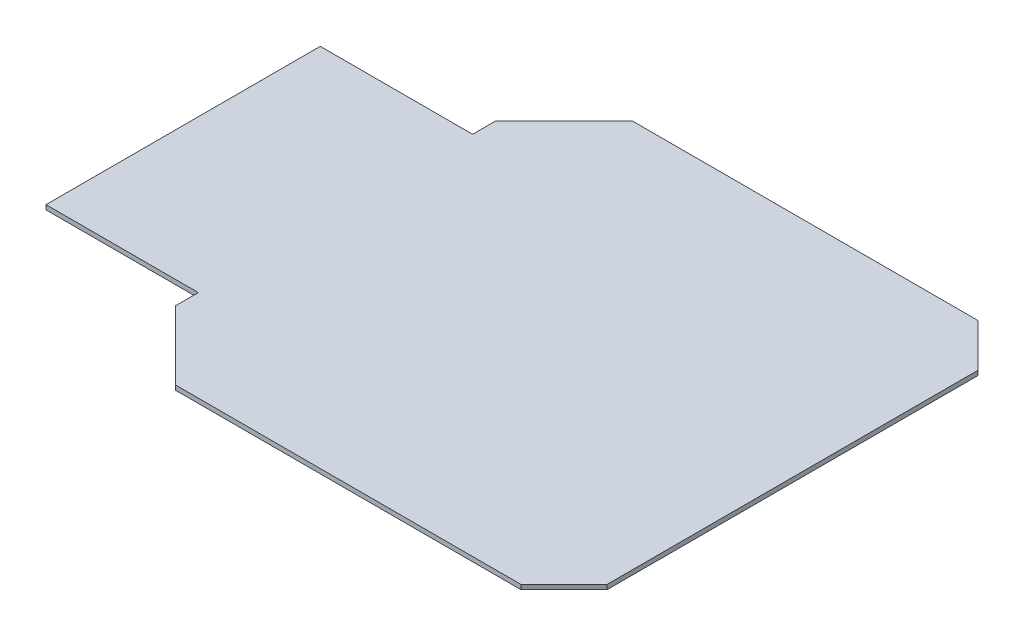
ISO-10303-21;
HEADER;
FILE_DESCRIPTION(('STEP AP214'),'2;1');
FILE_NAME('part.step','',(''),(''),'','','');
FILE_SCHEMA(('AUTOMOTIVE_DESIGN { 1 0 10303 214 1 1 1 1 }'));
ENDSEC;
DATA;
#1=APPLICATION_CONTEXT('core data for automotive mechanical design processes');
#2=APPLICATION_PROTOCOL_DEFINITION('international standard','automotive_design',2000,#1);
#3=PRODUCT_CONTEXT('',#1,'mechanical');
#4=PRODUCT('Part','Part','',(#3));
#5=PRODUCT_RELATED_PRODUCT_CATEGORY('part','',(#4));
#6=PRODUCT_DEFINITION_FORMATION('','',#4);
#7=PRODUCT_DEFINITION_CONTEXT('part definition',#1,'design');
#8=PRODUCT_DEFINITION('design','',#6,#7);
#9=PRODUCT_DEFINITION_SHAPE('','',#8);
#10=(LENGTH_UNIT() NAMED_UNIT(*) SI_UNIT(.MILLI.,.METRE.));
#11=(NAMED_UNIT(*) PLANE_ANGLE_UNIT() SI_UNIT($,.RADIAN.));
#12=(NAMED_UNIT(*) SI_UNIT($,.STERADIAN.) SOLID_ANGLE_UNIT());
#13=UNCERTAINTY_MEASURE_WITH_UNIT(LENGTH_MEASURE(1.E-05),#10,'distance_accuracy_value','');
#14=(GEOMETRIC_REPRESENTATION_CONTEXT(3) GLOBAL_UNCERTAINTY_ASSIGNED_CONTEXT((#13)) GLOBAL_UNIT_ASSIGNED_CONTEXT((#10,
#11,#12)) REPRESENTATION_CONTEXT('',''));
#15=CARTESIAN_POINT('',(0.,0.,0.));
#16=DIRECTION('',(0.,0.,1.));
#17=DIRECTION('',(1.,0.,0.));
#18=AXIS2_PLACEMENT_3D('',#15,#16,#17);
#19=CARTESIAN_POINT('',(126.532096115474,3.,-992.323086709291));
#20=DIRECTION('',(0.70710678118654,0.,-0.707106781186555));
#21=DIRECTION('',(-0.707106781186555,0.,-0.70710678118654));
#22=AXIS2_PLACEMENT_3D('',#19,#20,#21);
#23=PLANE('',#22);
#24=DIRECTION('',(0.707106781186555,0.,0.70710678118654));
#25=VECTOR('',#24,1.);
#26=CARTESIAN_POINT('',(126.532096115474,0.,-992.323086709291));
#27=LINE('',#26,#25);
#28=CARTESIAN_POINT('',(126.532096115474,0.,-992.323086709291));
#29=VERTEX_POINT('',#28);
#30=CARTESIAN_POINT('',(154.816367362936,0.,-964.038815461829));
#31=VERTEX_POINT('',#30);
#32=EDGE_CURVE('E164',#29,#31,#27,.T.);
#33=ORIENTED_EDGE('',*,*,#32,.F.);
#34=DIRECTION('',(0.,-1.,0.));
#35=VECTOR('',#34,1.);
#36=CARTESIAN_POINT('',(126.532096115474,3.,-992.323086709291));
#37=LINE('',#36,#35);
#38=CARTESIAN_POINT('',(126.532096115474,3.,-992.323086709291));
#39=VERTEX_POINT('',#38);
#40=EDGE_CURVE('E194',#39,#29,#37,.T.);
#41=ORIENTED_EDGE('',*,*,#40,.F.);
#42=DIRECTION('',(0.707106781186555,0.,0.70710678118654));
#43=VECTOR('',#42,1.);
#44=CARTESIAN_POINT('',(126.532096115474,3.,-992.323086709291));
#45=LINE('',#44,#43);
#46=CARTESIAN_POINT('',(154.816367362936,3.,-964.038815461829));
#47=VERTEX_POINT('',#46);
#48=EDGE_CURVE('E165',#39,#47,#45,.T.);
#49=ORIENTED_EDGE('',*,*,#48,.T.);
#50=DIRECTION('',(0.,-1.,0.));
#51=VECTOR('',#50,1.);
#52=CARTESIAN_POINT('',(154.816367362936,3.,-964.038815461829));
#53=LINE('',#52,#51);
#54=EDGE_CURVE('E179',#47,#31,#53,.T.);
#55=ORIENTED_EDGE('',*,*,#54,.T.);
#56=EDGE_LOOP('',(#33,#41,#49,#55));
#57=FACE_BOUND('',#56,.T.);
#58=ADVANCED_FACE('F35',(#57),#23,.T.);
#59=CARTESIAN_POINT('',(126.532096115474,3.,-992.323086709291));
#60=DIRECTION('',(0.,0.,1.));
#61=DIRECTION('',(1.,0.,0.));
#62=AXIS2_PLACEMENT_3D('',#59,#60,#61);
#63=PLANE('',#62);
#64=DIRECTION('',(-1.,0.,0.));
#65=VECTOR('',#64,1.);
#66=CARTESIAN_POINT('',(126.532096115474,0.,-992.323086709291));
#67=LINE('',#66,#65);
#68=CARTESIAN_POINT('',(-100.183632637064,0.,-992.323086709291));
#69=VERTEX_POINT('',#68);
#70=EDGE_CURVE('E169',#29,#69,#67,.T.);
#71=ORIENTED_EDGE('',*,*,#70,.T.);
#72=DIRECTION('',(0.,1.,0.));
#73=VECTOR('',#72,1.);
#74=CARTESIAN_POINT('',(-100.183632637064,-57.,-992.323086709291));
#75=LINE('',#74,#73);
#76=CARTESIAN_POINT('',(-100.183632637064,3.,-992.323086709291));
#77=VERTEX_POINT('',#76);
#78=EDGE_CURVE('E137',#69,#77,#75,.T.);
#79=ORIENTED_EDGE('',*,*,#78,.T.);
#80=DIRECTION('',(-1.,0.,0.));
#81=VECTOR('',#80,1.);
#82=CARTESIAN_POINT('',(126.532096115474,3.,-992.323086709291));
#83=LINE('',#82,#81);
#84=EDGE_CURVE('E136',#39,#77,#83,.T.);
#85=ORIENTED_EDGE('',*,*,#84,.F.);
#86=ORIENTED_EDGE('',*,*,#40,.T.);
#87=EDGE_LOOP('',(#71,#79,#85,#86));
#88=FACE_BOUND('',#87,.T.);
#89=ADVANCED_FACE('F253',(#88),#63,.F.);
#90=CARTESIAN_POINT('',(-245.183632637064,3.,-942.323086709291));
#91=DIRECTION('',(1.,0.,0.));
#92=DIRECTION('',(0.,0.,-1.));
#93=AXIS2_PLACEMENT_3D('',#90,#91,#92);
#94=PLANE('',#93);
#95=DIRECTION('',(0.,0.,1.));
#96=VECTOR('',#95,1.);
#97=CARTESIAN_POINT('',(-245.183632637064,3.,-942.323086709291));
#98=LINE('',#97,#96);
#99=CARTESIAN_POINT('',(-245.183632637064,3.,-932.323086709289));
#100=VERTEX_POINT('',#99);
#101=CARTESIAN_POINT('',(-245.183632637064,3.,-752.323086709291));
#102=VERTEX_POINT('',#101);
#103=EDGE_CURVE('E175',#100,#102,#98,.T.);
#104=ORIENTED_EDGE('',*,*,#103,.F.);
#105=DIRECTION('',(0.,-1.,0.));
#106=VECTOR('',#105,1.);
#107=CARTESIAN_POINT('',(-245.183632637064,3.,-932.323086709289));
#108=LINE('',#107,#106);
#109=CARTESIAN_POINT('',(-245.183632637064,0.,-932.323086709289));
#110=VERTEX_POINT('',#109);
#111=EDGE_CURVE('E161',#100,#110,#108,.T.);
#112=ORIENTED_EDGE('',*,*,#111,.T.);
#113=DIRECTION('',(0.,0.,1.));
#114=VECTOR('',#113,1.);
#115=CARTESIAN_POINT('',(-245.183632637064,0.,-942.323086709291));
#116=LINE('',#115,#114);
#117=CARTESIAN_POINT('',(-245.183632637064,0.,-752.323086709291));
#118=VERTEX_POINT('',#117);
#119=EDGE_CURVE('E189',#110,#118,#116,.T.);
#120=ORIENTED_EDGE('',*,*,#119,.T.);
#121=DIRECTION('',(0.,1.,0.));
#122=VECTOR('',#121,1.);
#123=CARTESIAN_POINT('',(-245.183632637064,3.,-752.323086709291));
#124=LINE('',#123,#122);
#125=EDGE_CURVE('E155',#118,#102,#124,.T.);
#126=ORIENTED_EDGE('',*,*,#125,.T.);
#127=EDGE_LOOP('',(#104,#112,#120,#126));
#128=FACE_BOUND('',#127,.T.);
#129=ADVANCED_FACE('F219',(#128),#94,.F.);
#130=CARTESIAN_POINT('',(-145.183632637064,3.,-692.323086709291));
#131=DIRECTION('',(0.,0.,-1.));
#132=DIRECTION('',(-1.,0.,0.));
#133=AXIS2_PLACEMENT_3D('',#130,#131,#132);
#134=PLANE('',#133);
#135=DIRECTION('',(1.,0.,0.));
#136=VECTOR('',#135,1.);
#137=CARTESIAN_POINT('',(-145.183632637064,3.,-692.323086709291));
#138=LINE('',#137,#136);
#139=CARTESIAN_POINT('',(-100.183632637064,3.,-692.323086709291));
#140=VERTEX_POINT('',#139);
#141=CARTESIAN_POINT('',(126.532096115474,3.,-692.323086709291));
#142=VERTEX_POINT('',#141);
#143=EDGE_CURVE('E173',#140,#142,#138,.T.);
#144=ORIENTED_EDGE('',*,*,#143,.F.);
#145=DIRECTION('',(0.,1.,0.));
#146=VECTOR('',#145,1.);
#147=CARTESIAN_POINT('',(-100.183632637064,-57.,-692.323086709291));
#148=LINE('',#147,#146);
#149=CARTESIAN_POINT('',(-100.183632637064,0.,-692.323086709291));
#150=VERTEX_POINT('',#149);
#151=EDGE_CURVE('E138',#150,#140,#148,.T.);
#152=ORIENTED_EDGE('',*,*,#151,.F.);
#153=DIRECTION('',(1.,0.,0.));
#154=VECTOR('',#153,1.);
#155=CARTESIAN_POINT('',(-145.183632637064,0.,-692.323086709291));
#156=LINE('',#155,#154);
#157=CARTESIAN_POINT('',(126.532096115474,0.,-692.323086709291));
#158=VERTEX_POINT('',#157);
#159=EDGE_CURVE('E187',#150,#158,#156,.T.);
#160=ORIENTED_EDGE('',*,*,#159,.T.);
#161=DIRECTION('',(0.,-1.,0.));
#162=VECTOR('',#161,1.);
#163=CARTESIAN_POINT('',(126.532096115474,3.,-692.323086709291));
#164=LINE('',#163,#162);
#165=EDGE_CURVE('E197',#142,#158,#164,.T.);
#166=ORIENTED_EDGE('',*,*,#165,.F.);
#167=EDGE_LOOP('',(#144,#152,#160,#166));
#168=FACE_BOUND('',#167,.T.);
#169=ADVANCED_FACE('F240',(#168),#134,.F.);
#170=CARTESIAN_POINT('',(126.532096115474,3.,-692.323086709291));
#171=DIRECTION('',(-0.707106781186547,0.,-0.707106781186548));
#172=DIRECTION('',(-0.707106781186548,0.,0.707106781186547));
#173=AXIS2_PLACEMENT_3D('',#170,#171,#172);
#174=PLANE('',#173);
#175=DIRECTION('',(0.707106781186548,0.,-0.707106781186547));
#176=VECTOR('',#175,1.);
#177=CARTESIAN_POINT('',(126.532096115474,0.,-692.323086709291));
#178=LINE('',#177,#176);
#179=CARTESIAN_POINT('',(154.816367362936,0.,-720.607357956753));
#180=VERTEX_POINT('',#179);
#181=EDGE_CURVE('E185',#158,#180,#178,.T.);
#182=ORIENTED_EDGE('',*,*,#181,.T.);
#183=DIRECTION('',(0.,-1.,0.));
#184=VECTOR('',#183,1.);
#185=CARTESIAN_POINT('',(154.816367362936,3.,-720.607357956753));
#186=LINE('',#185,#184);
#187=CARTESIAN_POINT('',(154.816367362936,3.,-720.607357956753));
#188=VERTEX_POINT('',#187);
#189=EDGE_CURVE('E200',#188,#180,#186,.T.);
#190=ORIENTED_EDGE('',*,*,#189,.F.);
#191=DIRECTION('',(0.707106781186548,0.,-0.707106781186547));
#192=VECTOR('',#191,1.);
#193=CARTESIAN_POINT('',(126.532096115474,3.,-692.323086709291));
#194=LINE('',#193,#192);
#195=EDGE_CURVE('E171',#142,#188,#194,.T.);
#196=ORIENTED_EDGE('',*,*,#195,.F.);
#197=ORIENTED_EDGE('',*,*,#165,.T.);
#198=EDGE_LOOP('',(#182,#190,#196,#197));
#199=FACE_BOUND('',#198,.T.);
#200=ADVANCED_FACE('F244',(#199),#174,.F.);
#201=CARTESIAN_POINT('',(154.816367362936,3.,-720.607357956753));
#202=DIRECTION('',(-1.,0.,0.));
#203=DIRECTION('',(0.,0.,1.));
#204=AXIS2_PLACEMENT_3D('',#201,#202,#203);
#205=PLANE('',#204);
#206=DIRECTION('',(0.,0.,-1.));
#207=VECTOR('',#206,1.);
#208=CARTESIAN_POINT('',(154.816367362936,0.,-720.607357956753));
#209=LINE('',#208,#207);
#210=EDGE_CURVE('E182',#180,#31,#209,.T.);
#211=ORIENTED_EDGE('',*,*,#210,.T.);
#212=ORIENTED_EDGE('',*,*,#54,.F.);
#213=DIRECTION('',(0.,0.,-1.));
#214=VECTOR('',#213,1.);
#215=CARTESIAN_POINT('',(154.816367362936,3.,-720.607357956753));
#216=LINE('',#215,#214);
#217=EDGE_CURVE('E168',#188,#47,#216,.T.);
#218=ORIENTED_EDGE('',*,*,#217,.F.);
#219=ORIENTED_EDGE('',*,*,#189,.T.);
#220=EDGE_LOOP('',(#211,#212,#218,#219));
#221=FACE_BOUND('',#220,.T.);
#222=ADVANCED_FACE('F248',(#221),#205,.F.);
#223=CARTESIAN_POINT('',(0.,3.,0.));
#224=DIRECTION('',(0.,1.,0.));
#225=DIRECTION('',(0.,0.,1.));
#226=AXIS2_PLACEMENT_3D('',#223,#224,#225);
#227=PLANE('',#226);
#228=DIRECTION('',(0.707106781186547,0.,-0.707106781186548));
#229=VECTOR('',#228,1.);
#230=CARTESIAN_POINT('',(-145.183632637064,3.,-947.323086709291));
#231=LINE('',#230,#229);
#232=CARTESIAN_POINT('',(-145.183632637064,3.,-947.323086709291));
#233=VERTEX_POINT('',#232);
#234=EDGE_CURVE('E121',#233,#77,#231,.T.);
#235=ORIENTED_EDGE('',*,*,#234,.F.);
#236=DIRECTION('',(0.,0.,-1.));
#237=VECTOR('',#236,1.);
#238=CARTESIAN_POINT('',(-145.183632637064,3.,-1023.29010824613));
#239=LINE('',#238,#237);
#240=CARTESIAN_POINT('',(-145.183632637064,3.,-932.323086709289));
#241=VERTEX_POINT('',#240);
#242=EDGE_CURVE('E133',#241,#233,#239,.T.);
#243=ORIENTED_EDGE('',*,*,#242,.F.);
#244=DIRECTION('',(1.,0.,0.));
#245=VECTOR('',#244,1.);
#246=CARTESIAN_POINT('',(-145.183632637064,3.,-932.323086709289));
#247=LINE('',#246,#245);
#248=EDGE_CURVE('E143',#100,#241,#247,.T.);
#249=ORIENTED_EDGE('',*,*,#248,.F.);
#250=ORIENTED_EDGE('',*,*,#103,.T.);
#251=DIRECTION('',(-1.,0.,0.));
#252=VECTOR('',#251,1.);
#253=CARTESIAN_POINT('',(-145.183632637064,3.,-752.323086709291));
#254=LINE('',#253,#252);
#255=CARTESIAN_POINT('',(-145.183632637064,3.,-752.323086709291));
#256=VERTEX_POINT('',#255);
#257=EDGE_CURVE('E148',#256,#102,#254,.T.);
#258=ORIENTED_EDGE('',*,*,#257,.F.);
#259=DIRECTION('',(0.,0.,-1.));
#260=VECTOR('',#259,1.);
#261=CARTESIAN_POINT('',(-145.183632637064,3.,-682.379586089124));
#262=LINE('',#261,#260);
#263=CARTESIAN_POINT('',(-145.183632637064,3.,-737.323086709291));
#264=VERTEX_POINT('',#263);
#265=EDGE_CURVE('E156',#264,#256,#262,.T.);
#266=ORIENTED_EDGE('',*,*,#265,.F.);
#267=DIRECTION('',(-0.707106781186547,0.,-0.707106781186548));
#268=VECTOR('',#267,1.);
#269=CARTESIAN_POINT('',(-145.183632637064,3.,-737.323086709291));
#270=LINE('',#269,#268);
#271=EDGE_CURVE('E49',#140,#264,#270,.T.);
#272=ORIENTED_EDGE('',*,*,#271,.F.);
#273=ORIENTED_EDGE('',*,*,#143,.T.);
#274=ORIENTED_EDGE('',*,*,#195,.T.);
#275=ORIENTED_EDGE('',*,*,#217,.T.);
#276=ORIENTED_EDGE('',*,*,#48,.F.);
#277=ORIENTED_EDGE('',*,*,#84,.T.);
#278=EDGE_LOOP('',(#235,#243,#249,#250,#258,#266,#272,#273,#274,#275,#276,#277));
#279=FACE_BOUND('',#278,.T.);
#280=ADVANCED_FACE('F131',(#279),#227,.T.);
#281=CARTESIAN_POINT('',(0.,0.,0.));
#282=DIRECTION('',(0.,1.,0.));
#283=DIRECTION('',(0.,0.,1.));
#284=AXIS2_PLACEMENT_3D('',#281,#282,#283);
#285=PLANE('',#284);
#286=DIRECTION('',(0.,0.,-1.));
#287=VECTOR('',#286,1.);
#288=CARTESIAN_POINT('',(-145.183632637064,0.,0.));
#289=LINE('',#288,#287);
#290=CARTESIAN_POINT('',(-145.183632637064,0.,-932.323086709289));
#291=VERTEX_POINT('',#290);
#292=CARTESIAN_POINT('',(-145.183632637064,0.,-947.323086709291));
#293=VERTEX_POINT('',#292);
#294=EDGE_CURVE('E127',#291,#293,#289,.T.);
#295=ORIENTED_EDGE('',*,*,#294,.T.);
#296=DIRECTION('',(0.707106781186547,0.,-0.707106781186548));
#297=VECTOR('',#296,1.);
#298=CARTESIAN_POINT('',(-546.253359673178,0.,-546.253359673177));
#299=LINE('',#298,#297);
#300=EDGE_CURVE('E56',#293,#69,#299,.T.);
#301=ORIENTED_EDGE('',*,*,#300,.T.);
#302=ORIENTED_EDGE('',*,*,#70,.F.);
#303=ORIENTED_EDGE('',*,*,#32,.T.);
#304=ORIENTED_EDGE('',*,*,#210,.F.);
#305=ORIENTED_EDGE('',*,*,#181,.F.);
#306=ORIENTED_EDGE('',*,*,#159,.F.);
#307=DIRECTION('',(-0.707106781186547,0.,-0.707106781186548));
#308=VECTOR('',#307,1.);
#309=CARTESIAN_POINT('',(296.069727036114,0.,-296.069727036113));
#310=LINE('',#309,#308);
#311=CARTESIAN_POINT('',(-145.183632637064,0.,-737.323086709291));
#312=VERTEX_POINT('',#311);
#313=EDGE_CURVE('E151',#150,#312,#310,.T.);
#314=ORIENTED_EDGE('',*,*,#313,.T.);
#315=DIRECTION('',(0.,0.,-1.));
#316=VECTOR('',#315,1.);
#317=CARTESIAN_POINT('',(-145.183632637064,0.,0.));
#318=LINE('',#317,#316);
#319=CARTESIAN_POINT('',(-145.183632637064,0.,-752.323086709291));
#320=VERTEX_POINT('',#319);
#321=EDGE_CURVE('E206',#312,#320,#318,.T.);
#322=ORIENTED_EDGE('',*,*,#321,.T.);
#323=DIRECTION('',(-1.,0.,0.));
#324=VECTOR('',#323,1.);
#325=CARTESIAN_POINT('',(0.,0.,-752.323086709291));
#326=LINE('',#325,#324);
#327=EDGE_CURVE('E196',#320,#118,#326,.T.);
#328=ORIENTED_EDGE('',*,*,#327,.T.);
#329=ORIENTED_EDGE('',*,*,#119,.F.);
#330=DIRECTION('',(1.,0.,0.));
#331=VECTOR('',#330,1.);
#332=CARTESIAN_POINT('',(0.,0.,-932.323086709289));
#333=LINE('',#332,#331);
#334=EDGE_CURVE('E208',#110,#291,#333,.T.);
#335=ORIENTED_EDGE('',*,*,#334,.T.);
#336=EDGE_LOOP('',(#295,#301,#302,#303,#304,#305,#306,#314,#322,#328,#329,#335));
#337=FACE_BOUND('',#336,.T.);
#338=ADVANCED_FACE('F212',(#337),#285,.F.);
#339=CARTESIAN_POINT('',(-145.183632637064,-7.,-682.379586089124));
#340=DIRECTION('',(1.,0.,0.));
#341=DIRECTION('',(0.,0.,-1.));
#342=AXIS2_PLACEMENT_3D('',#339,#340,#341);
#343=PLANE('',#342);
#344=ORIENTED_EDGE('',*,*,#321,.F.);
#345=DIRECTION('',(0.,1.,0.));
#346=VECTOR('',#345,1.);
#347=CARTESIAN_POINT('',(-145.183632637064,-7.,-737.323086709291));
#348=LINE('',#347,#346);
#349=EDGE_CURVE('E11',#312,#264,#348,.T.);
#350=ORIENTED_EDGE('',*,*,#349,.T.);
#351=ORIENTED_EDGE('',*,*,#265,.T.);
#352=DIRECTION('',(0.,1.,0.));
#353=VECTOR('',#352,1.);
#354=CARTESIAN_POINT('',(-145.183632637064,-7.,-752.323086709291));
#355=LINE('',#354,#353);
#356=EDGE_CURVE('E144',#320,#256,#355,.T.);
#357=ORIENTED_EDGE('',*,*,#356,.F.);
#358=EDGE_LOOP('',(#344,#350,#351,#357));
#359=FACE_BOUND('',#358,.T.);
#360=ADVANCED_FACE('F228',(#359),#343,.F.);
#361=CARTESIAN_POINT('',(-145.183632637064,-7.,-752.323086709291));
#362=DIRECTION('',(0.,0.,-1.));
#363=DIRECTION('',(-1.,0.,0.));
#364=AXIS2_PLACEMENT_3D('',#361,#362,#363);
#365=PLANE('',#364);
#366=ORIENTED_EDGE('',*,*,#327,.F.);
#367=ORIENTED_EDGE('',*,*,#356,.T.);
#368=ORIENTED_EDGE('',*,*,#257,.T.);
#369=ORIENTED_EDGE('',*,*,#125,.F.);
#370=EDGE_LOOP('',(#366,#367,#368,#369));
#371=FACE_BOUND('',#370,.T.);
#372=ADVANCED_FACE('F224',(#371),#365,.F.);
#373=CARTESIAN_POINT('',(-145.183632637064,-7.,-1023.29010824613));
#374=DIRECTION('',(1.,0.,0.));
#375=DIRECTION('',(0.,0.,-1.));
#376=AXIS2_PLACEMENT_3D('',#373,#374,#375);
#377=PLANE('',#376);
#378=ORIENTED_EDGE('',*,*,#242,.T.);
#379=DIRECTION('',(0.,-1.,0.));
#380=VECTOR('',#379,1.);
#381=CARTESIAN_POINT('',(-145.183632637064,-7.,-947.323086709291));
#382=LINE('',#381,#380);
#383=EDGE_CURVE('E42',#233,#293,#382,.T.);
#384=ORIENTED_EDGE('',*,*,#383,.T.);
#385=ORIENTED_EDGE('',*,*,#294,.F.);
#386=DIRECTION('',(0.,1.,0.));
#387=VECTOR('',#386,1.);
#388=CARTESIAN_POINT('',(-145.183632637064,-7.,-932.323086709289));
#389=LINE('',#388,#387);
#390=EDGE_CURVE('E141',#291,#241,#389,.T.);
#391=ORIENTED_EDGE('',*,*,#390,.T.);
#392=EDGE_LOOP('',(#378,#384,#385,#391));
#393=FACE_BOUND('',#392,.T.);
#394=ADVANCED_FACE('F140',(#393),#377,.F.);
#395=CARTESIAN_POINT('',(-145.183632637064,-7.,-932.323086709289));
#396=DIRECTION('',(0.,0.,1.));
#397=DIRECTION('',(1.,0.,0.));
#398=AXIS2_PLACEMENT_3D('',#395,#396,#397);
#399=PLANE('',#398);
#400=ORIENTED_EDGE('',*,*,#248,.T.);
#401=ORIENTED_EDGE('',*,*,#390,.F.);
#402=ORIENTED_EDGE('',*,*,#334,.F.);
#403=ORIENTED_EDGE('',*,*,#111,.F.);
#404=EDGE_LOOP('',(#400,#401,#402,#403));
#405=FACE_BOUND('',#404,.T.);
#406=ADVANCED_FACE('F216',(#405),#399,.F.);
#407=CARTESIAN_POINT('',(-145.183632637064,-57.,-947.323086709291));
#408=DIRECTION('',(0.707106781186548,0.,0.707106781186547));
#409=DIRECTION('',(0.707106781186547,0.,-0.707106781186548));
#410=AXIS2_PLACEMENT_3D('',#407,#408,#409);
#411=PLANE('',#410);
#412=ORIENTED_EDGE('',*,*,#383,.F.);
#413=ORIENTED_EDGE('',*,*,#234,.T.);
#414=ORIENTED_EDGE('',*,*,#78,.F.);
#415=ORIENTED_EDGE('',*,*,#300,.F.);
#416=EDGE_LOOP('',(#412,#413,#414,#415));
#417=FACE_BOUND('',#416,.T.);
#418=ADVANCED_FACE('F120',(#417),#411,.F.);
#419=CARTESIAN_POINT('',(-145.183632637064,-57.,-737.323086709291));
#420=DIRECTION('',(0.707106781186548,0.,-0.707106781186547));
#421=DIRECTION('',(-0.707106781186547,0.,-0.707106781186548));
#422=AXIS2_PLACEMENT_3D('',#419,#420,#421);
#423=PLANE('',#422);
#424=ORIENTED_EDGE('',*,*,#151,.T.);
#425=ORIENTED_EDGE('',*,*,#271,.T.);
#426=ORIENTED_EDGE('',*,*,#349,.F.);
#427=ORIENTED_EDGE('',*,*,#313,.F.);
#428=EDGE_LOOP('',(#424,#425,#426,#427));
#429=FACE_BOUND('',#428,.T.);
#430=ADVANCED_FACE('F230',(#429),#423,.F.);
#431=CLOSED_SHELL('',(#58,#89,#129,#169,#200,#222,#280,#338,#360,#372,#394,#406,#418,#430));
#432=MANIFOLD_SOLID_BREP('B2',#431);
#433=ADVANCED_BREP_SHAPE_REPRESENTATION('',(#18,#432),#14);
#434=SHAPE_DEFINITION_REPRESENTATION(#9,#433);
ENDSEC;
END-ISO-10303-21;
